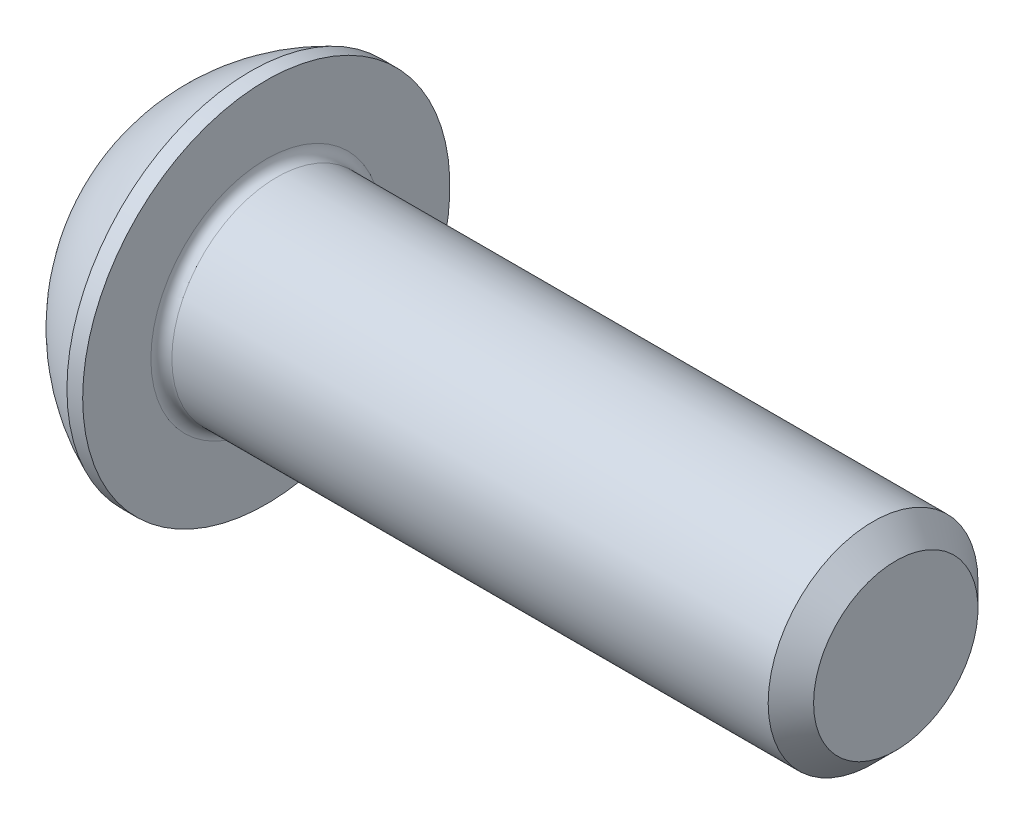
ISO-10303-21;
HEADER;
FILE_DESCRIPTION(('STEP AP214'),'2;1');
FILE_NAME('part.step','',(''),(''),'','','');
FILE_SCHEMA(('AUTOMOTIVE_DESIGN { 1 0 10303 214 1 1 1 1 }'));
ENDSEC;
DATA;
#1=APPLICATION_CONTEXT('core data for automotive mechanical design processes');
#2=APPLICATION_PROTOCOL_DEFINITION('international standard','automotive_design',2000,#1);
#3=PRODUCT_CONTEXT('',#1,'mechanical');
#4=PRODUCT('Part','Part','',(#3));
#5=PRODUCT_RELATED_PRODUCT_CATEGORY('part','',(#4));
#6=PRODUCT_DEFINITION_FORMATION('','',#4);
#7=PRODUCT_DEFINITION_CONTEXT('part definition',#1,'design');
#8=PRODUCT_DEFINITION('design','',#6,#7);
#9=PRODUCT_DEFINITION_SHAPE('','',#8);
#10=(LENGTH_UNIT() NAMED_UNIT(*) SI_UNIT(.MILLI.,.METRE.));
#11=(NAMED_UNIT(*) PLANE_ANGLE_UNIT() SI_UNIT($,.RADIAN.));
#12=(NAMED_UNIT(*) SI_UNIT($,.STERADIAN.) SOLID_ANGLE_UNIT());
#13=UNCERTAINTY_MEASURE_WITH_UNIT(LENGTH_MEASURE(1.E-05),#10,'distance_accuracy_value','');
#14=(GEOMETRIC_REPRESENTATION_CONTEXT(3) GLOBAL_UNCERTAINTY_ASSIGNED_CONTEXT((#13)) GLOBAL_UNIT_ASSIGNED_CONTEXT((#10,
#11,#12)) REPRESENTATION_CONTEXT('',''));
#15=CARTESIAN_POINT('',(0.,0.,0.));
#16=DIRECTION('',(0.,0.,1.));
#17=DIRECTION('',(1.,0.,0.));
#18=AXIS2_PLACEMENT_3D('',#15,#16,#17);
#19=CARTESIAN_POINT('',(0.,0.,0.));
#20=DIRECTION('',(-1.,0.,0.));
#21=DIRECTION('',(0.,0.,1.));
#22=AXIS2_PLACEMENT_3D('',#19,#20,#21);
#23=PLANE('',#22);
#24=CARTESIAN_POINT('',(0.,0.,0.));
#25=DIRECTION('',(-1.,0.,0.));
#26=DIRECTION('',(0.,0.,1.));
#27=AXIS2_PLACEMENT_3D('',#24,#25,#26);
#28=CIRCLE('',#27,0.875);
#29=CARTESIAN_POINT('',(0.,0.875,0.));
#30=VERTEX_POINT('',#29);
#31=EDGE_CURVE('E255',#30,#30,#28,.T.);
#32=ORIENTED_EDGE('',*,*,#31,.T.);
#33=EDGE_LOOP('',(#32));
#34=FACE_BOUND('',#33,.T.);
#35=CARTESIAN_POINT('',(0.,0.,0.));
#36=DIRECTION('',(-1.,0.,0.));
#37=DIRECTION('',(0.,0.,1.));
#38=AXIS2_PLACEMENT_3D('',#35,#36,#37);
#39=CIRCLE('',#38,0.715);
#40=CARTESIAN_POINT('',(0.,-0.71185022254595,0.0670392471711952));
#41=VERTEX_POINT('',#40);
#42=CARTESIAN_POINT('',(0.,-0.413982802373817,0.582960752828799));
#43=VERTEX_POINT('',#42);
#44=EDGE_CURVE('E238',#41,#43,#39,.T.);
#45=ORIENTED_EDGE('',*,*,#44,.F.);
#46=DIRECTION('',(0.,-0.499999999999998,-0.86602540378444));
#47=VECTOR('',#46,1.);
#48=CARTESIAN_POINT('',(0.,-0.750555349946509,0.));
#49=LINE('',#48,#47);
#50=CARTESIAN_POINT('',(0.,-0.750555349946509,0.));
#51=VERTEX_POINT('',#50);
#52=EDGE_CURVE('E436',#41,#51,#49,.T.);
#53=ORIENTED_EDGE('',*,*,#52,.T.);
#54=DIRECTION('',(0.,0.499999999999995,-0.866025403784441));
#55=VECTOR('',#54,1.);
#56=CARTESIAN_POINT('',(0.,-0.375277674973257,-0.65));
#57=LINE('',#56,#55);
#58=CARTESIAN_POINT('',(0.,-0.71185022254595,-0.0670392471711957));
#59=VERTEX_POINT('',#58);
#60=EDGE_CURVE('E188',#51,#59,#57,.T.);
#61=ORIENTED_EDGE('',*,*,#60,.T.);
#62=CARTESIAN_POINT('',(0.,-0.413982802373821,-0.582960752828796));
#63=VERTEX_POINT('',#62);
#64=EDGE_CURVE('E465',#63,#59,#39,.T.);
#65=ORIENTED_EDGE('',*,*,#64,.F.);
#66=CARTESIAN_POINT('',(0.,-0.375277674973257,-0.65));
#67=VERTEX_POINT('',#66);
#68=EDGE_CURVE('E435',#63,#67,#57,.T.);
#69=ORIENTED_EDGE('',*,*,#68,.T.);
#70=DIRECTION('',(0.,1.,0.));
#71=VECTOR('',#70,1.);
#72=CARTESIAN_POINT('',(0.,0.375277674973258,-0.65));
#73=LINE('',#72,#71);
#74=CARTESIAN_POINT('',(0.,-0.297867420172128,-0.65));
#75=VERTEX_POINT('',#74);
#76=EDGE_CURVE('E427',#67,#75,#73,.T.);
#77=ORIENTED_EDGE('',*,*,#76,.T.);
#78=CARTESIAN_POINT('',(0.,0.297867420172128,-0.65));
#79=VERTEX_POINT('',#78);
#80=EDGE_CURVE('E429',#79,#75,#39,.T.);
#81=ORIENTED_EDGE('',*,*,#80,.F.);
#82=CARTESIAN_POINT('',(0.,0.375277674973258,-0.65));
#83=VERTEX_POINT('',#82);
#84=EDGE_CURVE('E417',#79,#83,#73,.T.);
#85=ORIENTED_EDGE('',*,*,#84,.T.);
#86=DIRECTION('',(0.,0.499999999999999,0.866025403784439));
#87=VECTOR('',#86,1.);
#88=CARTESIAN_POINT('',(0.,0.750555349946514,0.));
#89=LINE('',#88,#87);
#90=CARTESIAN_POINT('',(0.,0.413982802373823,-0.582960752828795));
#91=VERTEX_POINT('',#90);
#92=EDGE_CURVE('E422',#83,#91,#89,.T.);
#93=ORIENTED_EDGE('',*,*,#92,.T.);
#94=CARTESIAN_POINT('',(0.,0.711850222545949,-0.0670392471712054));
#95=VERTEX_POINT('',#94);
#96=EDGE_CURVE('E467',#95,#91,#39,.T.);
#97=ORIENTED_EDGE('',*,*,#96,.F.);
#98=CARTESIAN_POINT('',(0.,0.750555349946514,0.));
#99=VERTEX_POINT('',#98);
#100=EDGE_CURVE('E424',#95,#99,#89,.T.);
#101=ORIENTED_EDGE('',*,*,#100,.T.);
#102=DIRECTION('',(0.,-0.500000000000001,0.866025403784438));
#103=VECTOR('',#102,1.);
#104=CARTESIAN_POINT('',(0.,0.375277674973258,0.649999999999998));
#105=LINE('',#104,#103);
#106=CARTESIAN_POINT('',(0.,0.711850222545949,0.0670392471712051));
#107=VERTEX_POINT('',#106);
#108=EDGE_CURVE('E407',#99,#107,#105,.T.);
#109=ORIENTED_EDGE('',*,*,#108,.T.);
#110=CARTESIAN_POINT('',(0.,0.413982802373821,0.582960752828796));
#111=VERTEX_POINT('',#110);
#112=EDGE_CURVE('E237',#111,#107,#39,.T.);
#113=ORIENTED_EDGE('',*,*,#112,.F.);
#114=CARTESIAN_POINT('',(0.,0.375277674973258,0.649999999999998));
#115=VERTEX_POINT('',#114);
#116=EDGE_CURVE('E403',#111,#115,#105,.T.);
#117=ORIENTED_EDGE('',*,*,#116,.T.);
#118=DIRECTION('',(0.,-1.,0.));
#119=VECTOR('',#118,1.);
#120=CARTESIAN_POINT('',(0.,-0.375277674973256,0.649999999999997));
#121=LINE('',#120,#119);
#122=CARTESIAN_POINT('',(0.,0.297867420172133,0.649999999999998));
#123=VERTEX_POINT('',#122);
#124=EDGE_CURVE('E176',#115,#123,#121,.T.);
#125=ORIENTED_EDGE('',*,*,#124,.T.);
#126=CARTESIAN_POINT('',(0.,-0.297867420172135,0.649999999999997));
#127=VERTEX_POINT('',#126);
#128=EDGE_CURVE('E234',#127,#123,#39,.T.);
#129=ORIENTED_EDGE('',*,*,#128,.F.);
#130=CARTESIAN_POINT('',(0.,-0.375277674973256,0.649999999999997));
#131=VERTEX_POINT('',#130);
#132=EDGE_CURVE('E401',#127,#131,#121,.T.);
#133=ORIENTED_EDGE('',*,*,#132,.T.);
#134=EDGE_CURVE('E434',#131,#43,#49,.T.);
#135=ORIENTED_EDGE('',*,*,#134,.T.);
#136=EDGE_LOOP('',(#45,#53,#61,#65,#69,#77,#81,#85,#93,#97,#101,#109,#113,#117,#125,#129,#133,#135));
#137=FACE_BOUND('',#136,.T.);
#138=ADVANCED_FACE('F41',(#34,#137),#23,.T.);
#139=CARTESIAN_POINT('',(0.,0.,0.));
#140=DIRECTION('',(-1.,0.,0.));
#141=DIRECTION('',(0.,0.,1.));
#142=AXIS2_PLACEMENT_3D('',#139,#140,#141);
#143=CYLINDRICAL_SURFACE('',#142,0.715);
#144=CARTESIAN_POINT('',(0.6,0.,0.));
#145=DIRECTION('',(-1.,0.,0.));
#146=DIRECTION('',(0.,0.,1.));
#147=AXIS2_PLACEMENT_3D('',#144,#145,#146);
#148=CIRCLE('',#147,0.715);
#149=CARTESIAN_POINT('',(0.6,-0.71185022254595,0.0670392471711951));
#150=VERTEX_POINT('',#149);
#151=CARTESIAN_POINT('',(0.6,-0.413982802373817,0.582960752828799));
#152=VERTEX_POINT('',#151);
#153=EDGE_CURVE('E459',#150,#152,#148,.T.);
#154=ORIENTED_EDGE('',*,*,#153,.F.);
#155=DIRECTION('',(-1.,0.,0.));
#156=VECTOR('',#155,1.);
#157=CARTESIAN_POINT('',(0.,-0.71185022254595,0.0670392471711949));
#158=LINE('',#157,#156);
#159=EDGE_CURVE('E173',#150,#41,#158,.T.);
#160=ORIENTED_EDGE('',*,*,#159,.T.);
#161=ORIENTED_EDGE('',*,*,#44,.T.);
#162=DIRECTION('',(-1.,0.,0.));
#163=VECTOR('',#162,1.);
#164=CARTESIAN_POINT('',(0.,-0.413982802373817,0.5829607528288));
#165=LINE('',#164,#163);
#166=EDGE_CURVE('E228',#43,#152,#165,.F.);
#167=ORIENTED_EDGE('',*,*,#166,.T.);
#168=EDGE_LOOP('',(#154,#160,#161,#167));
#169=FACE_BOUND('',#168,.T.);
#170=ADVANCED_FACE('F277',(#169),#143,.F.);
#171=CARTESIAN_POINT('',(0.6,-0.413982802373821,-0.582960752828796));
#172=VERTEX_POINT('',#171);
#173=CARTESIAN_POINT('',(0.6,-0.71185022254595,-0.0670392471711957));
#174=VERTEX_POINT('',#173);
#175=EDGE_CURVE('E455',#172,#174,#148,.T.);
#176=ORIENTED_EDGE('',*,*,#175,.F.);
#177=DIRECTION('',(-1.,0.,0.));
#178=VECTOR('',#177,1.);
#179=CARTESIAN_POINT('',(0.,-0.413982802373821,-0.582960752828796));
#180=LINE('',#179,#178);
#181=EDGE_CURVE('E222',#172,#63,#180,.T.);
#182=ORIENTED_EDGE('',*,*,#181,.T.);
#183=ORIENTED_EDGE('',*,*,#64,.T.);
#184=DIRECTION('',(-1.,0.,0.));
#185=VECTOR('',#184,1.);
#186=CARTESIAN_POINT('',(0.,-0.71185022254595,-0.0670392471711957));
#187=LINE('',#186,#185);
#188=EDGE_CURVE('E221',#59,#174,#187,.F.);
#189=ORIENTED_EDGE('',*,*,#188,.T.);
#190=EDGE_LOOP('',(#176,#182,#183,#189));
#191=FACE_BOUND('',#190,.T.);
#192=ADVANCED_FACE('F284',(#191),#143,.F.);
#193=CARTESIAN_POINT('',(0.6,0.297867420172128,-0.65));
#194=VERTEX_POINT('',#193);
#195=CARTESIAN_POINT('',(0.6,-0.297867420172128,-0.65));
#196=VERTEX_POINT('',#195);
#197=EDGE_CURVE('E453',#194,#196,#148,.T.);
#198=ORIENTED_EDGE('',*,*,#197,.F.);
#199=DIRECTION('',(-1.,0.,0.));
#200=VECTOR('',#199,1.);
#201=CARTESIAN_POINT('',(0.,0.297867420172128,-0.65));
#202=LINE('',#201,#200);
#203=EDGE_CURVE('E217',#194,#79,#202,.T.);
#204=ORIENTED_EDGE('',*,*,#203,.T.);
#205=ORIENTED_EDGE('',*,*,#80,.T.);
#206=DIRECTION('',(-1.,0.,0.));
#207=VECTOR('',#206,1.);
#208=CARTESIAN_POINT('',(0.,-0.297867420172128,-0.65));
#209=LINE('',#208,#207);
#210=EDGE_CURVE('E215',#75,#196,#209,.F.);
#211=ORIENTED_EDGE('',*,*,#210,.T.);
#212=EDGE_LOOP('',(#198,#204,#205,#211));
#213=FACE_BOUND('',#212,.T.);
#214=ADVANCED_FACE('F475',(#213),#143,.F.);
#215=CARTESIAN_POINT('',(0.6,0.711850222545949,-0.0670392471712054));
#216=VERTEX_POINT('',#215);
#217=CARTESIAN_POINT('',(0.6,0.413982802373823,-0.582960752828795));
#218=VERTEX_POINT('',#217);
#219=EDGE_CURVE('E375',#216,#218,#148,.T.);
#220=ORIENTED_EDGE('',*,*,#219,.F.);
#221=DIRECTION('',(-1.,0.,0.));
#222=VECTOR('',#221,1.);
#223=CARTESIAN_POINT('',(0.,0.711850222545949,-0.0670392471712054));
#224=LINE('',#223,#222);
#225=EDGE_CURVE('E212',#216,#95,#224,.T.);
#226=ORIENTED_EDGE('',*,*,#225,.T.);
#227=ORIENTED_EDGE('',*,*,#96,.T.);
#228=DIRECTION('',(-1.,0.,0.));
#229=VECTOR('',#228,1.);
#230=CARTESIAN_POINT('',(0.,0.413982802373823,-0.582960752828795));
#231=LINE('',#230,#229);
#232=EDGE_CURVE('E209',#91,#218,#231,.F.);
#233=ORIENTED_EDGE('',*,*,#232,.T.);
#234=EDGE_LOOP('',(#220,#226,#227,#233));
#235=FACE_BOUND('',#234,.T.);
#236=ADVANCED_FACE('F468',(#235),#143,.F.);
#237=CARTESIAN_POINT('',(0.6,0.413982802373821,0.582960752828796));
#238=VERTEX_POINT('',#237);
#239=CARTESIAN_POINT('',(0.6,0.711850222545949,0.0670392471712051));
#240=VERTEX_POINT('',#239);
#241=EDGE_CURVE('E232',#238,#240,#148,.T.);
#242=ORIENTED_EDGE('',*,*,#241,.F.);
#243=DIRECTION('',(-1.,0.,0.));
#244=VECTOR('',#243,1.);
#245=CARTESIAN_POINT('',(0.,0.413982802373821,0.582960752828796));
#246=LINE('',#245,#244);
#247=EDGE_CURVE('E207',#238,#111,#246,.T.);
#248=ORIENTED_EDGE('',*,*,#247,.T.);
#249=ORIENTED_EDGE('',*,*,#112,.T.);
#250=DIRECTION('',(-1.,0.,0.));
#251=VECTOR('',#250,1.);
#252=CARTESIAN_POINT('',(0.,0.711850222545949,0.0670392471712052));
#253=LINE('',#252,#251);
#254=EDGE_CURVE('E202',#107,#240,#253,.F.);
#255=ORIENTED_EDGE('',*,*,#254,.T.);
#256=EDGE_LOOP('',(#242,#248,#249,#255));
#257=FACE_BOUND('',#256,.T.);
#258=ADVANCED_FACE('F385',(#257),#143,.F.);
#259=CARTESIAN_POINT('',(0.6,-0.297867420172135,0.649999999999997));
#260=VERTEX_POINT('',#259);
#261=CARTESIAN_POINT('',(0.6,0.297867420172133,0.649999999999998));
#262=VERTEX_POINT('',#261);
#263=EDGE_CURVE('E229',#260,#262,#148,.T.);
#264=ORIENTED_EDGE('',*,*,#263,.F.);
#265=DIRECTION('',(-1.,0.,0.));
#266=VECTOR('',#265,1.);
#267=CARTESIAN_POINT('',(0.,-0.297867420172135,0.649999999999997));
#268=LINE('',#267,#266);
#269=EDGE_CURVE('E195',#260,#127,#268,.T.);
#270=ORIENTED_EDGE('',*,*,#269,.T.);
#271=ORIENTED_EDGE('',*,*,#128,.T.);
#272=DIRECTION('',(-1.,0.,0.));
#273=VECTOR('',#272,1.);
#274=CARTESIAN_POINT('',(0.,0.297867420172133,0.649999999999998));
#275=LINE('',#274,#273);
#276=EDGE_CURVE('E191',#123,#262,#275,.F.);
#277=ORIENTED_EDGE('',*,*,#276,.T.);
#278=EDGE_LOOP('',(#264,#270,#271,#277));
#279=FACE_BOUND('',#278,.T.);
#280=ADVANCED_FACE('F281',(#279),#143,.F.);
#281=CARTESIAN_POINT('',(1.68388157894737,0.,0.));
#282=DIRECTION('',(-1.,0.,0.));
#283=DIRECTION('',(0.,1.,0.));
#284=AXIS2_PLACEMENT_3D('',#281,#282,#283);
#285=SPHERICAL_SURFACE('',#284,1.89765175201308);
#286=CARTESIAN_POINT('',(0.95,0.,0.));
#287=DIRECTION('',(-1.,0.,0.));
#288=DIRECTION('',(0.,0.,1.));
#289=AXIS2_PLACEMENT_3D('',#286,#287,#288);
#290=CIRCLE('',#289,1.75);
#291=CARTESIAN_POINT('',(0.95,1.75,0.));
#292=VERTEX_POINT('',#291);
#293=EDGE_CURVE('E248',#292,#292,#290,.T.);
#294=CARTESIAN_POINT('',(0.95,1.75,0.));
#295=CARTESIAN_POINT('',(0.937340169559538,1.74469098940027,0.));
#296=CARTESIAN_POINT('',(0.924737968908448,1.73924455835412,0.));
#297=CARTESIAN_POINT('',(0.899654717595099,1.72807952164054,0.));
#298=CARTESIAN_POINT('',(0.887173666932838,1.7223609159731,0.));
#299=CARTESIAN_POINT('',(0.862338606007229,1.7106541962885,0.));
#300=CARTESIAN_POINT('',(0.849984595743881,1.70466608227132,0.));
#301=CARTESIAN_POINT('',(0.825409430903376,1.69242317344065,0.));
#302=CARTESIAN_POINT('',(0.81318827632622,1.68616837862716,0.));
#303=CARTESIAN_POINT('',(0.788884579669412,1.67339505215556,0.));
#304=CARTESIAN_POINT('',(0.77680203758976,1.66687652049746,0.));
#305=CARTESIAN_POINT('',(0.752781256357558,1.65357879096983,0.));
#306=CARTESIAN_POINT('',(0.740843017205007,1.64679959310029,0.));
#307=CARTESIAN_POINT('',(0.71711646458663,1.63298372389127,0.));
#308=CARTESIAN_POINT('',(0.705328151120803,1.6259470525518,0.));
#309=CARTESIAN_POINT('',(0.681907001944365,1.61161955058688,0.));
#310=CARTESIAN_POINT('',(0.670274166233754,1.60432871996143,0.));
#311=CARTESIAN_POINT('',(0.647169451430108,1.58949633326558,0.));
#312=CARTESIAN_POINT('',(0.635697572337074,1.58195477719518,0.));
#313=CARTESIAN_POINT('',(0.612920173817592,1.56662449155034,0.));
#314=CARTESIAN_POINT('',(0.601614654391145,1.55883576197591,0.));
#315=CARTESIAN_POINT('',(0.579175299902932,1.54301479767485,0.));
#316=CARTESIAN_POINT('',(0.568041464841166,1.53498256294822,0.));
#317=CARTESIAN_POINT('',(0.545950722919735,1.51867837138209,0.));
#318=CARTESIAN_POINT('',(0.534993816060069,1.51040641454259,0.));
#319=CARTESIAN_POINT('',(0.51326209105034,1.49362667469462,0.));
#320=CARTESIAN_POINT('',(0.502487272900276,1.48511889168615,0.));
#321=CARTESIAN_POINT('',(0.481124800056695,1.46787150651415,0.));
#322=CARTESIAN_POINT('',(0.470537145363177,1.45913190435061,0.));
#323=CARTESIAN_POINT('',(0.449553986028991,1.44142499706503,0.));
#324=CARTESIAN_POINT('',(0.439158481388324,1.43245769194298,0.));
#325=CARTESIAN_POINT('',(0.418564518256898,1.41429960218096,0.));
#326=CARTESIAN_POINT('',(0.408366059766139,1.40510881754099,0.));
#327=CARTESIAN_POINT('',(0.388170992226373,1.38650809743857,0.));
#328=CARTESIAN_POINT('',(0.378174383177366,1.37709816197613,0.));
#329=CARTESIAN_POINT('',(0.35838772274546,1.35806357214034,0.));
#330=CARTESIAN_POINT('',(0.348597671362561,1.348438917767,0.));
#331=CARTESIAN_POINT('',(0.32922873720226,1.32897942314977,0.));
#332=CARTESIAN_POINT('',(0.319649854424858,1.31914458290588,0.));
#333=CARTESIAN_POINT('',(0.30070776895829,1.29926934858169,0.));
#334=CARTESIAN_POINT('',(0.291344566269124,1.28922895450139,0.));
#335=CARTESIAN_POINT('',(0.272838250880315,1.26894734135071,0.));
#336=CARTESIAN_POINT('',(0.263695138180673,1.25870612228032,0.));
#337=CARTESIAN_POINT('',(0.245633309013679,1.2380276825808,0.));
#338=CARTESIAN_POINT('',(0.236714592546328,1.22759046195167,0.));
#339=CARTESIAN_POINT('',(0.219105756400304,1.20652493487909,0.));
#340=CARTESIAN_POINT('',(0.21041563672163,1.19589662843564,0.));
#341=CARTESIAN_POINT('',(0.193268087043462,1.17445393547738,0.));
#342=CARTESIAN_POINT('',(0.184810657043969,1.16363954896256,0.));
#343=CARTESIAN_POINT('',(0.168132470025252,1.14182978924308,0.));
#344=CARTESIAN_POINT('',(0.159911713006028,1.13083441603841,0.));
#345=CARTESIAN_POINT('',(0.143710743767988,1.10866786156894,0.));
#346=CARTESIAN_POINT('',(0.135730531549171,1.09749668030414,0.));
#347=CARTESIAN_POINT('',(0.120014410485326,1.07498377112164,0.));
#348=CARTESIAN_POINT('',(0.112278501640297,1.06364204320393,0.));
#349=CARTESIAN_POINT('',(0.0970546306648887,1.04079338254035,0.));
#350=CARTESIAN_POINT('',(0.0895666685345088,1.02928644979447,0.));
#351=CARTESIAN_POINT('',(0.0748422181852083,1.00611279876044,0.));
#352=CARTESIAN_POINT('',(0.0676057299662877,0.994446080472284,0.));
#353=CARTESIAN_POINT('',(0.0533876338292878,0.970958354192094,0.));
#354=CARTESIAN_POINT('',(0.0464060259112086,0.959137346200057,0.));
#355=CARTESIAN_POINT('',(0.0327009855576053,0.935346604180128,0.));
#356=CARTESIAN_POINT('',(0.0259775531220811,0.923376870152236,0.));
#357=CARTESIAN_POINT('',(0.0127920043413564,0.899294327831803,0.));
#358=CARTESIAN_POINT('',(0.00632988799615577,0.887181519539262,0.));
#359=CARTESIAN_POINT('',(0.,0.875,0.));
#360=B_SPLINE_CURVE_WITH_KNOTS('',3,(#294,#295,#296,#297,#298,#299,#300,#301,#302,#303,#304,
#305,#306,#307,#308,#309,#310,#311,#312,#313,#314,#315,#316,#317,#318,#319,#320,#321,#322,#323,
#324,#325,#326,#327,#328,#329,#330,#331,#332,#333,#334,#335,#336,#337,#338,#339,#340,#341,#342,
#343,#344,#345,#346,#347,#348,#349,#350,#351,#352,#353,#354,#355,#356,#357,#358,#359),
.UNSPECIFIED.,.F.,.F.,(4,2,2,2,2,2,2,2,2,2,2,2,2,2,2,2,2,2,2,2,2,2,2,2,2,2,2,2,2,2,2,2,4),(0.,
0.0411830717721068,0.0823661435442138,0.12354921531632,0.164732287088427,0.205915358860534,
0.247098430632641,0.288281502404748,0.329464574176855,0.370647645948962,0.411830717721068,
0.453013789493175,0.494196861265282,0.535379933037389,0.576563004809496,0.617746076581603,
0.658929148353709,0.700112220125816,0.741295291897923,0.78247836367003,0.823661435442137,
0.864844507214244,0.906027578986351,0.947210650758457,0.988393722530564,1.02957679430267,
1.07075986607478,1.11194293784688,1.15312600961899,1.1943090813911,1.23549215316321,
1.27667522493531,1.31785829670742),.UNSPECIFIED.);
#361=EDGE_CURVE('BSEAM287',#292,#30,#360,.T.);
#362=ORIENTED_EDGE('',*,*,#293,.T.);
#363=ORIENTED_EDGE('',*,*,#31,.F.);
#364=ORIENTED_EDGE('',*,*,#361,.T.);
#365=ORIENTED_EDGE('',*,*,#361,.F.);
#366=EDGE_LOOP('',(#362,#364,#363,#365));
#367=FACE_BOUND('',#366,.T.);
#368=ADVANCED_FACE('F287',(#367),#285,.T.);
#369=CARTESIAN_POINT('',(0.,0.,0.));
#370=DIRECTION('',(-1.,0.,0.));
#371=DIRECTION('',(0.,0.,1.));
#372=AXIS2_PLACEMENT_3D('',#369,#370,#371);
#373=CYLINDRICAL_SURFACE('',#372,1.75);
#374=ORIENTED_EDGE('',*,*,#293,.F.);
#375=EDGE_LOOP('',(#374));
#376=FACE_BOUND('',#375,.T.);
#377=CARTESIAN_POINT('',(1.1,0.,0.));
#378=DIRECTION('',(-1.,0.,0.));
#379=DIRECTION('',(0.,0.,1.));
#380=AXIS2_PLACEMENT_3D('',#377,#378,#379);
#381=CIRCLE('',#380,1.75);
#382=CARTESIAN_POINT('',(1.1,0.,1.75));
#383=VERTEX_POINT('',#382);
#384=EDGE_CURVE('E246',#383,#383,#381,.T.);
#385=ORIENTED_EDGE('',*,*,#384,.T.);
#386=EDGE_LOOP('',(#385));
#387=FACE_BOUND('',#386,.T.);
#388=ADVANCED_FACE('F293',(#376,#387),#373,.T.);
#389=CARTESIAN_POINT('',(1.1,0.999999999999992,0.));
#390=DIRECTION('',(-1.,0.,0.));
#391=DIRECTION('',(0.,0.,1.));
#392=AXIS2_PLACEMENT_3D('',#389,#390,#391);
#393=PLANE('',#392);
#394=CARTESIAN_POINT('',(1.1,0.,0.));
#395=DIRECTION('',(-1.,0.,0.));
#396=DIRECTION('',(0.,0.,1.));
#397=AXIS2_PLACEMENT_3D('',#394,#395,#396);
#398=CIRCLE('',#397,1.09999999999999);
#399=CARTESIAN_POINT('',(1.1,0.,1.09999999999999));
#400=VERTEX_POINT('',#399);
#401=EDGE_CURVE('E47',#400,#400,#398,.T.);
#402=ORIENTED_EDGE('',*,*,#401,.T.);
#403=EDGE_LOOP('',(#402));
#404=FACE_BOUND('',#403,.T.);
#405=ORIENTED_EDGE('',*,*,#384,.F.);
#406=EDGE_LOOP('',(#405));
#407=FACE_BOUND('',#406,.T.);
#408=ADVANCED_FACE('F257',(#404,#407),#393,.F.);
#409=CARTESIAN_POINT('',(0.,0.,0.));
#410=DIRECTION('',(-1.,0.,0.));
#411=DIRECTION('',(0.,0.,1.));
#412=AXIS2_PLACEMENT_3D('',#409,#410,#411);
#413=CYLINDRICAL_SURFACE('',#412,0.999999999999992);
#414=CARTESIAN_POINT('',(1.2,0.,0.));
#415=DIRECTION('',(-1.,0.,0.));
#416=DIRECTION('',(0.,0.,1.));
#417=AXIS2_PLACEMENT_3D('',#414,#415,#416);
#418=CIRCLE('',#417,0.999999999999992);
#419=CARTESIAN_POINT('',(1.2,0.,0.999999999999992));
#420=VERTEX_POINT('',#419);
#421=EDGE_CURVE('E11',#420,#420,#418,.F.);
#422=ORIENTED_EDGE('',*,*,#421,.T.);
#423=EDGE_LOOP('',(#422));
#424=FACE_BOUND('',#423,.T.);
#425=CARTESIAN_POINT('',(6.8835,0.,0.));
#426=DIRECTION('',(-1.,0.,0.));
#427=DIRECTION('',(0.,0.,1.));
#428=AXIS2_PLACEMENT_3D('',#425,#426,#427);
#429=CIRCLE('',#428,0.999999999999992);
#430=CARTESIAN_POINT('',(6.8835,0.,0.999999999999992));
#431=VERTEX_POINT('',#430);
#432=EDGE_CURVE('E243',#431,#431,#429,.T.);
#433=ORIENTED_EDGE('',*,*,#432,.T.);
#434=EDGE_LOOP('',(#433));
#435=FACE_BOUND('',#434,.T.);
#436=ADVANCED_FACE('F296',(#424,#435),#413,.T.);
#437=CARTESIAN_POINT('',(7.1,0.,0.));
#438=DIRECTION('',(-1.,0.,0.));
#439=DIRECTION('',(0.,0.,1.));
#440=AXIS2_PLACEMENT_3D('',#437,#438,#439);
#441=CONICAL_SURFACE('',#440,0.7835,0.785398163397426);
#442=ORIENTED_EDGE('',*,*,#432,.F.);
#443=EDGE_LOOP('',(#442));
#444=FACE_BOUND('',#443,.T.);
#445=CARTESIAN_POINT('',(7.1,0.,0.));
#446=DIRECTION('',(-1.,0.,0.));
#447=DIRECTION('',(0.,0.,1.));
#448=AXIS2_PLACEMENT_3D('',#445,#446,#447);
#449=CIRCLE('',#448,0.7835);
#450=CARTESIAN_POINT('',(7.1,0.,0.7835));
#451=VERTEX_POINT('',#450);
#452=EDGE_CURVE('E239',#451,#451,#449,.T.);
#453=ORIENTED_EDGE('',*,*,#452,.T.);
#454=EDGE_LOOP('',(#453));
#455=FACE_BOUND('',#454,.T.);
#456=ADVANCED_FACE('F271',(#444,#455),#441,.T.);
#457=CARTESIAN_POINT('',(7.1,0.,0.));
#458=DIRECTION('',(-1.,0.,0.));
#459=DIRECTION('',(0.,0.,1.));
#460=AXIS2_PLACEMENT_3D('',#457,#458,#459);
#461=PLANE('',#460);
#462=ORIENTED_EDGE('',*,*,#452,.F.);
#463=EDGE_LOOP('',(#462));
#464=FACE_BOUND('',#463,.T.);
#465=ADVANCED_FACE('F264',(#464),#461,.F.);
#466=CARTESIAN_POINT('',(1.2,0.,0.));
#467=DIRECTION('',(-1.,0.,0.));
#468=DIRECTION('',(0.,0.,1.));
#469=AXIS2_PLACEMENT_3D('',#466,#467,#468);
#470=TOROIDAL_SURFACE('',#469,1.09999999999999,0.1);
#471=ORIENTED_EDGE('',*,*,#421,.F.);
#472=EDGE_LOOP('',(#471));
#473=FACE_BOUND('',#472,.T.);
#474=ORIENTED_EDGE('',*,*,#401,.F.);
#475=EDGE_LOOP('',(#474));
#476=FACE_BOUND('',#475,.T.);
#477=ADVANCED_FACE('F43',(#473,#476),#470,.F.);
#478=CARTESIAN_POINT('',(1.01280544247059,0.,0.));
#479=DIRECTION('',(-1.,0.,0.));
#480=DIRECTION('',(0.,0.,1.));
#481=AXIS2_PLACEMENT_3D('',#478,#479,#480);
#482=CONICAL_SURFACE('',#481,0.,1.04719755119659);
#483=EDGE_CURVE('E233',#262,#238,#148,.T.);
#484=ORIENTED_EDGE('',*,*,#483,.T.);
#485=ORIENTED_EDGE('',*,*,#241,.T.);
#486=EDGE_CURVE('E362',#240,#216,#148,.T.);
#487=ORIENTED_EDGE('',*,*,#486,.T.);
#488=ORIENTED_EDGE('',*,*,#219,.T.);
#489=EDGE_CURVE('E458',#218,#194,#148,.T.);
#490=ORIENTED_EDGE('',*,*,#489,.T.);
#491=ORIENTED_EDGE('',*,*,#197,.T.);
#492=EDGE_CURVE('E451',#196,#172,#148,.T.);
#493=ORIENTED_EDGE('',*,*,#492,.T.);
#494=ORIENTED_EDGE('',*,*,#175,.T.);
#495=EDGE_CURVE('E185',#174,#150,#148,.T.);
#496=ORIENTED_EDGE('',*,*,#495,.T.);
#497=ORIENTED_EDGE('',*,*,#153,.T.);
#498=EDGE_CURVE('E460',#152,#260,#148,.T.);
#499=ORIENTED_EDGE('',*,*,#498,.T.);
#500=ORIENTED_EDGE('',*,*,#263,.T.);
#501=EDGE_LOOP('',(#484,#485,#487,#488,#490,#491,#493,#494,#496,#497,#499,#500));
#502=FACE_BOUND('',#501,.T.);
#503=CARTESIAN_POINT('',(1.01280544247059,0.,0.));
#504=VERTEX_POINT('',#503);
#505=VERTEX_LOOP('',#504);
#506=FACE_BOUND('',#505,.T.);
#507=ADVANCED_FACE('F263',(#502,#506),#482,.F.);
#508=CARTESIAN_POINT('',(0.6,-1.12583302491976,-0.65));
#509=DIRECTION('',(1.,0.,0.));
#510=DIRECTION('',(0.,0.,-1.));
#511=AXIS2_PLACEMENT_3D('',#508,#509,#510);
#512=PLANE('',#511);
#513=ORIENTED_EDGE('',*,*,#492,.F.);
#514=DIRECTION('',(0.,1.,0.));
#515=VECTOR('',#514,1.);
#516=CARTESIAN_POINT('',(0.6,0.375277674973258,-0.65));
#517=LINE('',#516,#515);
#518=CARTESIAN_POINT('',(0.6,-0.375277674973257,-0.65));
#519=VERTEX_POINT('',#518);
#520=EDGE_CURVE('E439',#519,#196,#517,.T.);
#521=ORIENTED_EDGE('',*,*,#520,.F.);
#522=DIRECTION('',(0.,0.499999999999995,-0.866025403784441));
#523=VECTOR('',#522,1.);
#524=CARTESIAN_POINT('',(0.6,-0.375277674973257,-0.65));
#525=LINE('',#524,#523);
#526=EDGE_CURVE('E187',#172,#519,#525,.T.);
#527=ORIENTED_EDGE('',*,*,#526,.F.);
#528=EDGE_LOOP('',(#513,#521,#527));
#529=FACE_BOUND('',#528,.T.);
#530=ADVANCED_FACE('F268',(#529),#512,.F.);
#531=CARTESIAN_POINT('',(0.6,0.375277674973258,-0.65));
#532=DIRECTION('',(0.,0.,1.));
#533=DIRECTION('',(1.,0.,0.));
#534=AXIS2_PLACEMENT_3D('',#531,#532,#533);
#535=PLANE('',#534);
#536=ORIENTED_EDGE('',*,*,#76,.F.);
#537=DIRECTION('',(-1.,0.,0.));
#538=VECTOR('',#537,1.);
#539=CARTESIAN_POINT('',(0.6,-0.375277674973257,-0.65));
#540=LINE('',#539,#538);
#541=EDGE_CURVE('E192',#519,#67,#540,.T.);
#542=ORIENTED_EDGE('',*,*,#541,.F.);
#543=ORIENTED_EDGE('',*,*,#520,.T.);
#544=ORIENTED_EDGE('',*,*,#210,.F.);
#545=EDGE_LOOP('',(#536,#542,#543,#544));
#546=FACE_BOUND('',#545,.T.);
#547=ADVANCED_FACE('F313',(#546),#535,.T.);
#548=CARTESIAN_POINT('',(0.6,-0.375277674973257,-0.65));
#549=DIRECTION('',(0.,0.866025403784441,0.499999999999995));
#550=DIRECTION('',(0.,-0.499999999999995,0.866025403784441));
#551=AXIS2_PLACEMENT_3D('',#548,#549,#550);
#552=PLANE('',#551);
#553=ORIENTED_EDGE('',*,*,#526,.T.);
#554=ORIENTED_EDGE('',*,*,#541,.T.);
#555=ORIENTED_EDGE('',*,*,#68,.F.);
#556=ORIENTED_EDGE('',*,*,#181,.F.);
#557=EDGE_LOOP('',(#553,#554,#555,#556));
#558=FACE_BOUND('',#557,.T.);
#559=ADVANCED_FACE('F312',(#558),#552,.T.);
#560=ORIENTED_EDGE('',*,*,#495,.F.);
#561=CARTESIAN_POINT('',(0.6,-0.750555349946509,0.));
#562=VERTEX_POINT('',#561);
#563=EDGE_CURVE('E177',#562,#174,#525,.T.);
#564=ORIENTED_EDGE('',*,*,#563,.F.);
#565=DIRECTION('',(0.,-0.499999999999998,-0.86602540378444));
#566=VECTOR('',#565,1.);
#567=CARTESIAN_POINT('',(0.6,-0.750555349946509,0.));
#568=LINE('',#567,#566);
#569=EDGE_CURVE('E63',#150,#562,#568,.T.);
#570=ORIENTED_EDGE('',*,*,#569,.F.);
#571=EDGE_LOOP('',(#560,#564,#570));
#572=FACE_BOUND('',#571,.T.);
#573=ADVANCED_FACE('F179',(#572),#512,.F.);
#574=ORIENTED_EDGE('',*,*,#60,.F.);
#575=DIRECTION('',(-1.,0.,0.));
#576=VECTOR('',#575,1.);
#577=CARTESIAN_POINT('',(0.6,-0.750555349946509,0.));
#578=LINE('',#577,#576);
#579=EDGE_CURVE('E167',#562,#51,#578,.T.);
#580=ORIENTED_EDGE('',*,*,#579,.F.);
#581=ORIENTED_EDGE('',*,*,#563,.T.);
#582=ORIENTED_EDGE('',*,*,#188,.F.);
#583=EDGE_LOOP('',(#574,#580,#581,#582));
#584=FACE_BOUND('',#583,.T.);
#585=ADVANCED_FACE('F189',(#584),#552,.T.);
#586=CARTESIAN_POINT('',(0.6,-0.750555349946509,0.));
#587=DIRECTION('',(0.,0.86602540378444,-0.499999999999998));
#588=DIRECTION('',(0.,0.499999999999998,0.86602540378444));
#589=AXIS2_PLACEMENT_3D('',#586,#587,#588);
#590=PLANE('',#589);
#591=ORIENTED_EDGE('',*,*,#569,.T.);
#592=ORIENTED_EDGE('',*,*,#579,.T.);
#593=ORIENTED_EDGE('',*,*,#52,.F.);
#594=ORIENTED_EDGE('',*,*,#159,.F.);
#595=EDGE_LOOP('',(#591,#592,#593,#594));
#596=FACE_BOUND('',#595,.T.);
#597=ADVANCED_FACE('F166',(#596),#590,.T.);
#598=ORIENTED_EDGE('',*,*,#498,.F.);
#599=CARTESIAN_POINT('',(0.6,-0.375277674973256,0.649999999999997));
#600=VERTEX_POINT('',#599);
#601=EDGE_CURVE('E174',#600,#152,#568,.T.);
#602=ORIENTED_EDGE('',*,*,#601,.F.);
#603=DIRECTION('',(0.,-1.,0.));
#604=VECTOR('',#603,1.);
#605=CARTESIAN_POINT('',(0.6,-0.375277674973256,0.649999999999997));
#606=LINE('',#605,#604);
#607=EDGE_CURVE('E57',#260,#600,#606,.T.);
#608=ORIENTED_EDGE('',*,*,#607,.F.);
#609=EDGE_LOOP('',(#598,#602,#608));
#610=FACE_BOUND('',#609,.T.);
#611=ADVANCED_FACE('F342',(#610),#512,.F.);
#612=CARTESIAN_POINT('',(0.6,-0.375277674973256,0.649999999999997));
#613=DIRECTION('',(0.,0.,-1.));
#614=DIRECTION('',(0.,1.,0.));
#615=AXIS2_PLACEMENT_3D('',#612,#613,#614);
#616=PLANE('',#615);
#617=ORIENTED_EDGE('',*,*,#607,.T.);
#618=DIRECTION('',(-1.,0.,0.));
#619=VECTOR('',#618,1.);
#620=CARTESIAN_POINT('',(0.6,-0.375277674973256,0.649999999999997));
#621=LINE('',#620,#619);
#622=EDGE_CURVE('E396',#600,#131,#621,.T.);
#623=ORIENTED_EDGE('',*,*,#622,.T.);
#624=ORIENTED_EDGE('',*,*,#132,.F.);
#625=ORIENTED_EDGE('',*,*,#269,.F.);
#626=EDGE_LOOP('',(#617,#623,#624,#625));
#627=FACE_BOUND('',#626,.T.);
#628=ADVANCED_FACE('F307',(#627),#616,.T.);
#629=ORIENTED_EDGE('',*,*,#134,.F.);
#630=ORIENTED_EDGE('',*,*,#622,.F.);
#631=ORIENTED_EDGE('',*,*,#601,.T.);
#632=ORIENTED_EDGE('',*,*,#166,.F.);
#633=EDGE_LOOP('',(#629,#630,#631,#632));
#634=FACE_BOUND('',#633,.T.);
#635=ADVANCED_FACE('F304',(#634),#590,.T.);
#636=ORIENTED_EDGE('',*,*,#483,.F.);
#637=CARTESIAN_POINT('',(0.6,0.375277674973258,0.649999999999998));
#638=VERTEX_POINT('',#637);
#639=EDGE_CURVE('E390',#638,#262,#606,.T.);
#640=ORIENTED_EDGE('',*,*,#639,.F.);
#641=DIRECTION('',(0.,-0.500000000000001,0.866025403784438));
#642=VECTOR('',#641,1.);
#643=CARTESIAN_POINT('',(0.6,0.375277674973258,0.649999999999998));
#644=LINE('',#643,#642);
#645=EDGE_CURVE('E380',#238,#638,#644,.T.);
#646=ORIENTED_EDGE('',*,*,#645,.F.);
#647=EDGE_LOOP('',(#636,#640,#646));
#648=FACE_BOUND('',#647,.T.);
#649=ADVANCED_FACE('F308',(#648),#512,.F.);
#650=ORIENTED_EDGE('',*,*,#124,.F.);
#651=DIRECTION('',(-1.,0.,0.));
#652=VECTOR('',#651,1.);
#653=CARTESIAN_POINT('',(0.6,0.375277674973258,0.649999999999998));
#654=LINE('',#653,#652);
#655=EDGE_CURVE('E391',#638,#115,#654,.T.);
#656=ORIENTED_EDGE('',*,*,#655,.F.);
#657=ORIENTED_EDGE('',*,*,#639,.T.);
#658=ORIENTED_EDGE('',*,*,#276,.F.);
#659=EDGE_LOOP('',(#650,#656,#657,#658));
#660=FACE_BOUND('',#659,.T.);
#661=ADVANCED_FACE('F331',(#660),#616,.T.);
#662=CARTESIAN_POINT('',(0.6,0.375277674973258,0.649999999999998));
#663=DIRECTION('',(0.,-0.866025403784438,-0.500000000000001));
#664=DIRECTION('',(0.,0.500000000000001,-0.866025403784438));
#665=AXIS2_PLACEMENT_3D('',#662,#663,#664);
#666=PLANE('',#665);
#667=ORIENTED_EDGE('',*,*,#645,.T.);
#668=ORIENTED_EDGE('',*,*,#655,.T.);
#669=ORIENTED_EDGE('',*,*,#116,.F.);
#670=ORIENTED_EDGE('',*,*,#247,.F.);
#671=EDGE_LOOP('',(#667,#668,#669,#670));
#672=FACE_BOUND('',#671,.T.);
#673=ADVANCED_FACE('F326',(#672),#666,.T.);
#674=ORIENTED_EDGE('',*,*,#486,.F.);
#675=CARTESIAN_POINT('',(0.6,0.750555349946514,0.));
#676=VERTEX_POINT('',#675);
#677=EDGE_CURVE('E370',#676,#240,#644,.T.);
#678=ORIENTED_EDGE('',*,*,#677,.F.);
#679=DIRECTION('',(0.,0.499999999999999,0.866025403784439));
#680=VECTOR('',#679,1.);
#681=CARTESIAN_POINT('',(0.6,0.750555349946514,0.));
#682=LINE('',#681,#680);
#683=EDGE_CURVE('E368',#216,#676,#682,.T.);
#684=ORIENTED_EDGE('',*,*,#683,.F.);
#685=EDGE_LOOP('',(#674,#678,#684));
#686=FACE_BOUND('',#685,.T.);
#687=ADVANCED_FACE('F327',(#686),#512,.F.);
#688=ORIENTED_EDGE('',*,*,#108,.F.);
#689=DIRECTION('',(-1.,0.,0.));
#690=VECTOR('',#689,1.);
#691=CARTESIAN_POINT('',(0.6,0.750555349946514,0.));
#692=LINE('',#691,#690);
#693=EDGE_CURVE('E376',#676,#99,#692,.T.);
#694=ORIENTED_EDGE('',*,*,#693,.F.);
#695=ORIENTED_EDGE('',*,*,#677,.T.);
#696=ORIENTED_EDGE('',*,*,#254,.F.);
#697=EDGE_LOOP('',(#688,#694,#695,#696));
#698=FACE_BOUND('',#697,.T.);
#699=ADVANCED_FACE('F325',(#698),#666,.T.);
#700=CARTESIAN_POINT('',(0.6,0.750555349946514,0.));
#701=DIRECTION('',(0.,-0.866025403784439,0.499999999999999));
#702=DIRECTION('',(0.,-0.499999999999999,-0.866025403784439));
#703=AXIS2_PLACEMENT_3D('',#700,#701,#702);
#704=PLANE('',#703);
#705=ORIENTED_EDGE('',*,*,#683,.T.);
#706=ORIENTED_EDGE('',*,*,#693,.T.);
#707=ORIENTED_EDGE('',*,*,#100,.F.);
#708=ORIENTED_EDGE('',*,*,#225,.F.);
#709=EDGE_LOOP('',(#705,#706,#707,#708));
#710=FACE_BOUND('',#709,.T.);
#711=ADVANCED_FACE('F323',(#710),#704,.T.);
#712=CARTESIAN_POINT('',(0.6,0.375277674973258,-0.65));
#713=VERTEX_POINT('',#712);
#714=EDGE_CURVE('E184',#194,#713,#517,.T.);
#715=ORIENTED_EDGE('',*,*,#714,.T.);
#716=DIRECTION('',(-1.,0.,0.));
#717=VECTOR('',#716,1.);
#718=CARTESIAN_POINT('',(0.6,0.375277674973258,-0.65));
#719=LINE('',#718,#717);
#720=EDGE_CURVE('E199',#713,#83,#719,.T.);
#721=ORIENTED_EDGE('',*,*,#720,.T.);
#722=ORIENTED_EDGE('',*,*,#84,.F.);
#723=ORIENTED_EDGE('',*,*,#203,.F.);
#724=EDGE_LOOP('',(#715,#721,#722,#723));
#725=FACE_BOUND('',#724,.T.);
#726=ADVANCED_FACE('F319',(#725),#535,.T.);
#727=ORIENTED_EDGE('',*,*,#489,.F.);
#728=EDGE_CURVE('E438',#713,#218,#682,.T.);
#729=ORIENTED_EDGE('',*,*,#728,.F.);
#730=ORIENTED_EDGE('',*,*,#714,.F.);
#731=EDGE_LOOP('',(#727,#729,#730));
#732=FACE_BOUND('',#731,.T.);
#733=ADVANCED_FACE('F322',(#732),#512,.F.);
#734=ORIENTED_EDGE('',*,*,#92,.F.);
#735=ORIENTED_EDGE('',*,*,#720,.F.);
#736=ORIENTED_EDGE('',*,*,#728,.T.);
#737=ORIENTED_EDGE('',*,*,#232,.F.);
#738=EDGE_LOOP('',(#734,#735,#736,#737));
#739=FACE_BOUND('',#738,.T.);
#740=ADVANCED_FACE('F316',(#739),#704,.T.);
#741=CLOSED_SHELL('',(#138,#170,#192,#214,#236,#258,#280,#368,#388,#408,#436,#456,#465,#477,
#507,#530,#547,#559,#573,#585,#597,#611,#628,#635,#649,#661,#673,#687,#699,#711,#726,#733,#740));
#742=MANIFOLD_SOLID_BREP('B2',#741);
#743=ADVANCED_BREP_SHAPE_REPRESENTATION('',(#18,#742),#14);
#744=SHAPE_DEFINITION_REPRESENTATION(#9,#743);
ENDSEC;
END-ISO-10303-21;
